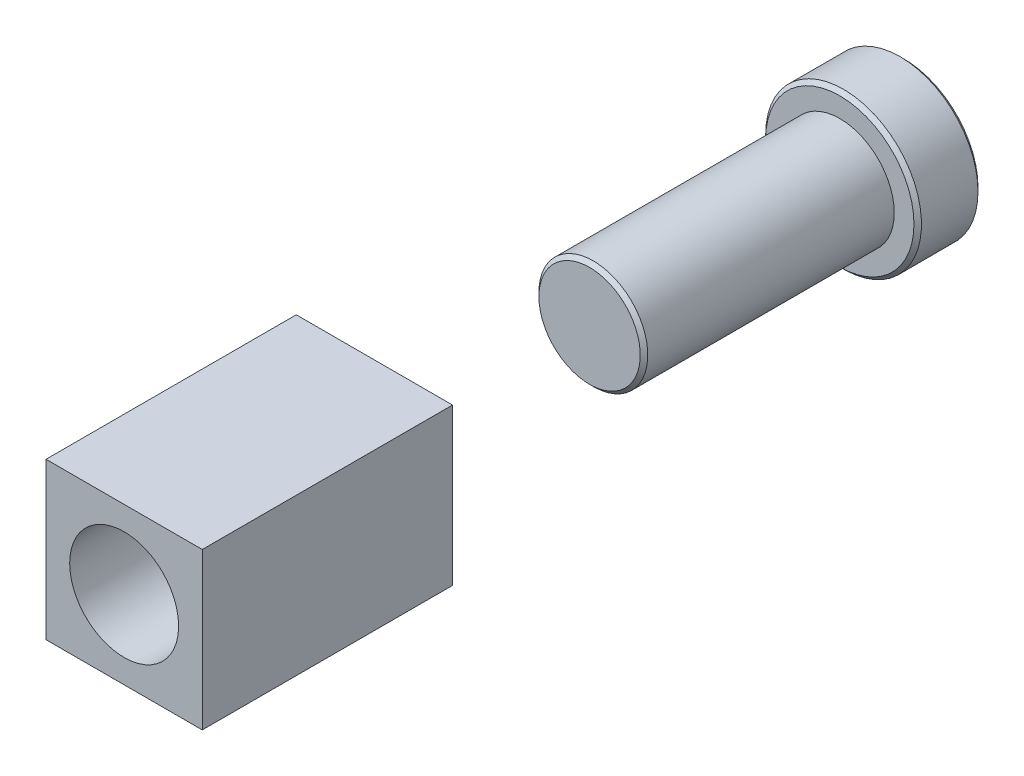
ISO-10303-21;
HEADER;
FILE_DESCRIPTION(('STEP AP214'),'2;1');
FILE_NAME('part.step','',(''),(''),'','','');
FILE_SCHEMA(('AUTOMOTIVE_DESIGN { 1 0 10303 214 1 1 1 1 }'));
ENDSEC;
DATA;
#1=APPLICATION_CONTEXT('core data for automotive mechanical design processes');
#2=APPLICATION_PROTOCOL_DEFINITION('international standard','automotive_design',2000,#1);
#3=PRODUCT_CONTEXT('',#1,'mechanical');
#4=PRODUCT('Part','Part','',(#3));
#5=PRODUCT_RELATED_PRODUCT_CATEGORY('part','',(#4));
#6=PRODUCT_DEFINITION_FORMATION('','',#4);
#7=PRODUCT_DEFINITION_CONTEXT('part definition',#1,'design');
#8=PRODUCT_DEFINITION('design','',#6,#7);
#9=PRODUCT_DEFINITION_SHAPE('','',#8);
#10=(LENGTH_UNIT() NAMED_UNIT(*) SI_UNIT(.MILLI.,.METRE.));
#11=(NAMED_UNIT(*) PLANE_ANGLE_UNIT() SI_UNIT($,.RADIAN.));
#12=(NAMED_UNIT(*) SI_UNIT($,.STERADIAN.) SOLID_ANGLE_UNIT());
#13=UNCERTAINTY_MEASURE_WITH_UNIT(LENGTH_MEASURE(1.E-05),#10,'distance_accuracy_value','');
#14=(GEOMETRIC_REPRESENTATION_CONTEXT(3) GLOBAL_UNCERTAINTY_ASSIGNED_CONTEXT((#13)) GLOBAL_UNIT_ASSIGNED_CONTEXT((#10,
#11,#12)) REPRESENTATION_CONTEXT('',''));
#15=CARTESIAN_POINT('',(0.,0.,0.));
#16=DIRECTION('',(0.,0.,1.));
#17=DIRECTION('',(1.,0.,0.));
#18=AXIS2_PLACEMENT_3D('',#15,#16,#17);
#19=CARTESIAN_POINT('',(-15.8613491960392,15.8613491960392,158.283276511442));
#20=DIRECTION('',(1.,0.,0.));
#21=DIRECTION('',(0.,1.,0.));
#22=AXIS2_PLACEMENT_3D('',#19,#20,#21);
#23=PLANE('',#22);
#24=DIRECTION('',(0.,-1.,0.));
#25=VECTOR('',#24,1.);
#26=CARTESIAN_POINT('',(-15.8613491960392,15.8613491960392,107.483276511442));
#27=LINE('',#26,#25);
#28=CARTESIAN_POINT('',(-15.8613491960392,15.8613491960392,107.483276511442));
#29=VERTEX_POINT('',#28);
#30=CARTESIAN_POINT('',(-15.8613491960392,-15.8613491960392,107.483276511442));
#31=VERTEX_POINT('',#30);
#32=EDGE_CURVE('E104',#29,#31,#27,.T.);
#33=ORIENTED_EDGE('',*,*,#32,.T.);
#34=DIRECTION('',(0.,0.,-1.));
#35=VECTOR('',#34,1.);
#36=CARTESIAN_POINT('',(-15.8613491960392,-15.8613491960392,158.283276511442));
#37=LINE('',#36,#35);
#38=CARTESIAN_POINT('',(-15.8613491960392,-15.8613491960392,158.283276511442));
#39=VERTEX_POINT('',#38);
#40=EDGE_CURVE('E12',#39,#31,#37,.T.);
#41=ORIENTED_EDGE('',*,*,#40,.F.);
#42=DIRECTION('',(0.,-1.,0.));
#43=VECTOR('',#42,1.);
#44=CARTESIAN_POINT('',(-15.8613491960392,15.8613491960392,158.283276511442));
#45=LINE('',#44,#43);
#46=CARTESIAN_POINT('',(-15.8613491960392,15.8613491960392,158.283276511442));
#47=VERTEX_POINT('',#46);
#48=EDGE_CURVE('E92',#47,#39,#45,.T.);
#49=ORIENTED_EDGE('',*,*,#48,.F.);
#50=DIRECTION('',(0.,0.,-1.));
#51=VECTOR('',#50,1.);
#52=CARTESIAN_POINT('',(-15.8613491960392,15.8613491960392,158.283276511442));
#53=LINE('',#52,#51);
#54=EDGE_CURVE('E100',#47,#29,#53,.T.);
#55=ORIENTED_EDGE('',*,*,#54,.T.);
#56=EDGE_LOOP('',(#33,#41,#49,#55));
#57=FACE_BOUND('',#56,.T.);
#58=ADVANCED_FACE('F41',(#57),#23,.F.);
#59=CARTESIAN_POINT('',(-15.8613491960392,-15.8613491960392,158.283276511442));
#60=DIRECTION('',(0.,1.,0.));
#61=DIRECTION('',(0.,0.,1.));
#62=AXIS2_PLACEMENT_3D('',#59,#60,#61);
#63=PLANE('',#62);
#64=DIRECTION('',(1.,0.,0.));
#65=VECTOR('',#64,1.);
#66=CARTESIAN_POINT('',(-15.8613491960392,-15.8613491960392,107.483276511442));
#67=LINE('',#66,#65);
#68=CARTESIAN_POINT('',(15.8613491960392,-15.8613491960392,107.483276511442));
#69=VERTEX_POINT('',#68);
#70=EDGE_CURVE('E96',#31,#69,#67,.T.);
#71=ORIENTED_EDGE('',*,*,#70,.T.);
#72=DIRECTION('',(0.,0.,-1.));
#73=VECTOR('',#72,1.);
#74=CARTESIAN_POINT('',(15.8613491960392,-15.8613491960392,158.283276511442));
#75=LINE('',#74,#73);
#76=CARTESIAN_POINT('',(15.8613491960392,-15.8613491960392,158.283276511442));
#77=VERTEX_POINT('',#76);
#78=EDGE_CURVE('E49',#77,#69,#75,.T.);
#79=ORIENTED_EDGE('',*,*,#78,.F.);
#80=DIRECTION('',(1.,0.,0.));
#81=VECTOR('',#80,1.);
#82=CARTESIAN_POINT('',(-15.8613491960392,-15.8613491960392,158.283276511442));
#83=LINE('',#82,#81);
#84=EDGE_CURVE('E87',#39,#77,#83,.T.);
#85=ORIENTED_EDGE('',*,*,#84,.F.);
#86=ORIENTED_EDGE('',*,*,#40,.T.);
#87=EDGE_LOOP('',(#71,#79,#85,#86));
#88=FACE_BOUND('',#87,.T.);
#89=ADVANCED_FACE('F95',(#88),#63,.F.);
#90=CARTESIAN_POINT('',(15.8613491960392,15.8613491960392,158.283276511442));
#91=DIRECTION('',(-1.,0.,0.));
#92=DIRECTION('',(0.,-1.,0.));
#93=AXIS2_PLACEMENT_3D('',#90,#91,#92);
#94=PLANE('',#93);
#95=DIRECTION('',(0.,1.,0.));
#96=VECTOR('',#95,1.);
#97=CARTESIAN_POINT('',(15.8613491960392,15.8613491960392,107.483276511442));
#98=LINE('',#97,#96);
#99=CARTESIAN_POINT('',(15.8613491960392,15.8613491960392,107.483276511442));
#100=VERTEX_POINT('',#99);
#101=EDGE_CURVE('E74',#69,#100,#98,.T.);
#102=ORIENTED_EDGE('',*,*,#101,.T.);
#103=DIRECTION('',(0.,0.,-1.));
#104=VECTOR('',#103,1.);
#105=CARTESIAN_POINT('',(15.8613491960392,15.8613491960392,158.283276511442));
#106=LINE('',#105,#104);
#107=CARTESIAN_POINT('',(15.8613491960392,15.8613491960392,158.283276511442));
#108=VERTEX_POINT('',#107);
#109=EDGE_CURVE('E97',#108,#100,#106,.T.);
#110=ORIENTED_EDGE('',*,*,#109,.F.);
#111=DIRECTION('',(0.,1.,0.));
#112=VECTOR('',#111,1.);
#113=CARTESIAN_POINT('',(15.8613491960392,15.8613491960392,158.283276511442));
#114=LINE('',#113,#112);
#115=EDGE_CURVE('E90',#77,#108,#114,.T.);
#116=ORIENTED_EDGE('',*,*,#115,.F.);
#117=ORIENTED_EDGE('',*,*,#78,.T.);
#118=EDGE_LOOP('',(#102,#110,#116,#117));
#119=FACE_BOUND('',#118,.T.);
#120=ADVANCED_FACE('F98',(#119),#94,.F.);
#121=CARTESIAN_POINT('',(-15.8613491960392,15.8613491960392,158.283276511442));
#122=DIRECTION('',(0.,-1.,0.));
#123=DIRECTION('',(0.,0.,-1.));
#124=AXIS2_PLACEMENT_3D('',#121,#122,#123);
#125=PLANE('',#124);
#126=DIRECTION('',(-1.,0.,0.));
#127=VECTOR('',#126,1.);
#128=CARTESIAN_POINT('',(-15.8613491960392,15.8613491960392,107.483276511442));
#129=LINE('',#128,#127);
#130=EDGE_CURVE('E80',#100,#29,#129,.T.);
#131=ORIENTED_EDGE('',*,*,#130,.T.);
#132=ORIENTED_EDGE('',*,*,#54,.F.);
#133=DIRECTION('',(-1.,0.,0.));
#134=VECTOR('',#133,1.);
#135=CARTESIAN_POINT('',(-15.8613491960392,15.8613491960392,158.283276511442));
#136=LINE('',#135,#134);
#137=EDGE_CURVE('E57',#108,#47,#136,.T.);
#138=ORIENTED_EDGE('',*,*,#137,.F.);
#139=ORIENTED_EDGE('',*,*,#109,.T.);
#140=EDGE_LOOP('',(#131,#132,#138,#139));
#141=FACE_BOUND('',#140,.T.);
#142=ADVANCED_FACE('F112',(#141),#125,.F.);
#143=CARTESIAN_POINT('',(0.,0.,158.283276511442));
#144=DIRECTION('',(0.,0.,1.));
#145=DIRECTION('',(1.,0.,0.));
#146=AXIS2_PLACEMENT_3D('',#143,#144,#145);
#147=PLANE('',#146);
#148=CARTESIAN_POINT('',(0.,0.,158.283276511442));
#149=DIRECTION('',(0.,0.,-1.));
#150=DIRECTION('',(-1.,0.,0.));
#151=AXIS2_PLACEMENT_3D('',#148,#149,#150);
#152=CIRCLE('',#151,11.05535);
#153=CARTESIAN_POINT('',(-11.05535,0.,158.283276511442));
#154=VERTEX_POINT('',#153);
#155=EDGE_CURVE('E107',#154,#154,#152,.T.);
#156=ORIENTED_EDGE('',*,*,#155,.T.);
#157=EDGE_LOOP('',(#156));
#158=FACE_BOUND('',#157,.T.);
#159=ORIENTED_EDGE('',*,*,#48,.T.);
#160=ORIENTED_EDGE('',*,*,#84,.T.);
#161=ORIENTED_EDGE('',*,*,#115,.T.);
#162=ORIENTED_EDGE('',*,*,#137,.T.);
#163=EDGE_LOOP('',(#159,#160,#161,#162));
#164=FACE_BOUND('',#163,.T.);
#165=ADVANCED_FACE('F88',(#158,#164),#147,.T.);
#166=CARTESIAN_POINT('',(0.,0.,107.483276511442));
#167=DIRECTION('',(0.,0.,1.));
#168=DIRECTION('',(1.,0.,0.));
#169=AXIS2_PLACEMENT_3D('',#166,#167,#168);
#170=PLANE('',#169);
#171=CARTESIAN_POINT('',(0.,0.,107.483276511442));
#172=DIRECTION('',(0.,0.,-1.));
#173=DIRECTION('',(-1.,0.,0.));
#174=AXIS2_PLACEMENT_3D('',#171,#172,#173);
#175=CIRCLE('',#174,11.05535);
#176=CARTESIAN_POINT('',(-11.05535,0.,107.483276511442));
#177=VERTEX_POINT('',#176);
#178=EDGE_CURVE('E118',#177,#177,#175,.T.);
#179=ORIENTED_EDGE('',*,*,#178,.F.);
#180=EDGE_LOOP('',(#179));
#181=FACE_BOUND('',#180,.T.);
#182=ORIENTED_EDGE('',*,*,#32,.F.);
#183=ORIENTED_EDGE('',*,*,#130,.F.);
#184=ORIENTED_EDGE('',*,*,#101,.F.);
#185=ORIENTED_EDGE('',*,*,#70,.F.);
#186=EDGE_LOOP('',(#182,#183,#184,#185));
#187=FACE_BOUND('',#186,.T.);
#188=ADVANCED_FACE('F115',(#181,#187),#170,.F.);
#189=CARTESIAN_POINT('',(0.,0.,158.283276511442));
#190=DIRECTION('',(0.,0.,-1.));
#191=DIRECTION('',(-1.,0.,0.));
#192=AXIS2_PLACEMENT_3D('',#189,#190,#191);
#193=CYLINDRICAL_SURFACE('',#192,11.05535);
#194=ORIENTED_EDGE('',*,*,#155,.F.);
#195=EDGE_LOOP('',(#194));
#196=FACE_BOUND('',#195,.T.);
#197=ORIENTED_EDGE('',*,*,#178,.T.);
#198=EDGE_LOOP('',(#197));
#199=FACE_BOUND('',#198,.T.);
#200=ADVANCED_FACE('F125',(#196,#199),#193,.F.);
#201=CLOSED_SHELL('',(#58,#89,#120,#142,#165,#188,#200));
#202=MANIFOLD_SOLID_BREP('B2',#201);
#203=CARTESIAN_POINT('',(0.,0.,12.9988235294118));
#204=DIRECTION('',(0.,0.,1.));
#205=DIRECTION('',(1.,0.,0.));
#206=AXIS2_PLACEMENT_3D('',#203,#204,#205);
#207=PLANE('',#206);
#208=CARTESIAN_POINT('',(0.,0.,12.9988235294118));
#209=DIRECTION('',(0.,0.,1.));
#210=DIRECTION('',(1.,0.,0.));
#211=AXIS2_PLACEMENT_3D('',#208,#209,#210);
#212=CIRCLE('',#211,15.0495000000001);
#213=CARTESIAN_POINT('',(15.0495000000001,0.,12.9988235294118));
#214=VERTEX_POINT('',#213);
#215=EDGE_CURVE('E197',#214,#214,#212,.T.);
#216=ORIENTED_EDGE('',*,*,#215,.T.);
#217=EDGE_LOOP('',(#216));
#218=FACE_BOUND('',#217,.T.);
#219=CARTESIAN_POINT('',(0.,0.,12.9988235294118));
#220=DIRECTION('',(0.,0.,1.));
#221=DIRECTION('',(1.,0.,0.));
#222=AXIS2_PLACEMENT_3D('',#219,#220,#221);
#223=CIRCLE('',#222,11.049);
#224=CARTESIAN_POINT('',(11.049,0.,12.9988235294118));
#225=VERTEX_POINT('',#224);
#226=EDGE_CURVE('E212',#225,#225,#223,.T.);
#227=ORIENTED_EDGE('',*,*,#226,.F.);
#228=EDGE_LOOP('',(#227));
#229=FACE_BOUND('',#228,.T.);
#230=ADVANCED_FACE('F186',(#218,#229),#207,.T.);
#231=CARTESIAN_POINT('',(0.,0.,12.9988235294118));
#232=DIRECTION('',(0.,0.,-1.));
#233=DIRECTION('',(-1.,0.,0.));
#234=AXIS2_PLACEMENT_3D('',#231,#232,#233);
#235=CYLINDRICAL_SURFACE('',#234,15.8115);
#236=CARTESIAN_POINT('',(0.,0.,0.762000000000034));
#237=DIRECTION('',(0.,0.,1.));
#238=DIRECTION('',(1.,0.,0.));
#239=AXIS2_PLACEMENT_3D('',#236,#237,#238);
#240=CIRCLE('',#239,15.8115);
#241=CARTESIAN_POINT('',(-15.8115,0.,0.762000000000032));
#242=VERTEX_POINT('',#241);
#243=EDGE_CURVE('E206',#242,#242,#240,.T.);
#244=CARTESIAN_POINT('',(0.,0.,12.2368235294118));
#245=DIRECTION('',(0.,0.,1.));
#246=DIRECTION('',(1.,0.,0.));
#247=AXIS2_PLACEMENT_3D('',#244,#245,#246);
#248=CIRCLE('',#247,15.8115);
#249=CARTESIAN_POINT('',(-15.8115,0.,12.2368235294118));
#250=VERTEX_POINT('',#249);
#251=EDGE_CURVE('E209',#250,#250,#248,.F.);
#252=CARTESIAN_POINT('',(-15.8115,0.,0.762000000000032));
#253=CARTESIAN_POINT('',(-15.8115,0.,0.881529411764738));
#254=CARTESIAN_POINT('',(-15.8115,0.,1.00105882352944));
#255=CARTESIAN_POINT('',(-15.8115,0.,1.24011764705886));
#256=CARTESIAN_POINT('',(-15.8115,0.,1.35964705882356));
#257=CARTESIAN_POINT('',(-15.8115,0.,1.59870588235297));
#258=CARTESIAN_POINT('',(-15.8115,0.,1.71823529411768));
#259=CARTESIAN_POINT('',(-15.8115,0.,1.95729411764709));
#260=CARTESIAN_POINT('',(-15.8115,0.,2.0768235294118));
#261=CARTESIAN_POINT('',(-15.8115,0.,2.31588235294121));
#262=CARTESIAN_POINT('',(-15.8115,0.,2.43541176470592));
#263=CARTESIAN_POINT('',(-15.8115,0.,2.67447058823533));
#264=CARTESIAN_POINT('',(-15.8115,0.,2.79400000000004));
#265=CARTESIAN_POINT('',(-15.8115,0.,3.03305882352945));
#266=CARTESIAN_POINT('',(-15.8115,0.,3.15258823529415));
#267=CARTESIAN_POINT('',(-15.8115,0.,3.39164705882357));
#268=CARTESIAN_POINT('',(-15.8115,0.,3.51117647058827));
#269=CARTESIAN_POINT('',(-15.8115,0.,3.75023529411768));
#270=CARTESIAN_POINT('',(-15.8115,0.,3.86976470588239));
#271=CARTESIAN_POINT('',(-15.8115,0.,4.1088235294118));
#272=CARTESIAN_POINT('',(-15.8115,0.,4.22835294117651));
#273=CARTESIAN_POINT('',(-15.8115,0.,4.46741176470592));
#274=CARTESIAN_POINT('',(-15.8115,0.,4.58694117647063));
#275=CARTESIAN_POINT('',(-15.8115,0.,4.82600000000004));
#276=CARTESIAN_POINT('',(-15.8115,0.,4.94552941176475));
#277=CARTESIAN_POINT('',(-15.8115,0.,5.18458823529416));
#278=CARTESIAN_POINT('',(-15.8115,0.,5.30411764705886));
#279=CARTESIAN_POINT('',(-15.8115,0.,5.54317647058827));
#280=CARTESIAN_POINT('',(-15.8115,0.,5.66270588235298));
#281=CARTESIAN_POINT('',(-15.8115,0.,5.90176470588239));
#282=CARTESIAN_POINT('',(-15.8115,0.,6.0212941176471));
#283=CARTESIAN_POINT('',(-15.8115,0.,6.26035294117651));
#284=CARTESIAN_POINT('',(-15.8115,0.,6.37988235294122));
#285=CARTESIAN_POINT('',(-15.8115,0.,6.61894117647063));
#286=CARTESIAN_POINT('',(-15.8115,0.,6.73847058823534));
#287=CARTESIAN_POINT('',(-15.8115,0.,6.97752941176475));
#288=CARTESIAN_POINT('',(-15.8115,0.,7.09705882352945));
#289=CARTESIAN_POINT('',(-15.8115,0.,7.33611764705887));
#290=CARTESIAN_POINT('',(-15.8115,0.,7.45564705882357));
#291=CARTESIAN_POINT('',(-15.8115,0.,7.69470588235298));
#292=CARTESIAN_POINT('',(-15.8115,0.,7.81423529411769));
#293=CARTESIAN_POINT('',(-15.8115,0.,8.0532941176471));
#294=CARTESIAN_POINT('',(-15.8115,0.,8.17282352941181));
#295=CARTESIAN_POINT('',(-15.8115,0.,8.41188235294122));
#296=CARTESIAN_POINT('',(-15.8115,0.,8.53141176470593));
#297=CARTESIAN_POINT('',(-15.8115,0.,8.77047058823534));
#298=CARTESIAN_POINT('',(-15.8115,0.,8.89000000000004));
#299=CARTESIAN_POINT('',(-15.8115,0.,9.12905882352946));
#300=CARTESIAN_POINT('',(-15.8115,0.,9.24858823529416));
#301=CARTESIAN_POINT('',(-15.8115,0.,9.48764705882357));
#302=CARTESIAN_POINT('',(-15.8115,0.,9.60717647058828));
#303=CARTESIAN_POINT('',(-15.8115,0.,9.84623529411769));
#304=CARTESIAN_POINT('',(-15.8115,0.,9.9657647058824));
#305=CARTESIAN_POINT('',(-15.8115,0.,10.2048235294118));
#306=CARTESIAN_POINT('',(-15.8115,0.,10.3243529411765));
#307=CARTESIAN_POINT('',(-15.8115,0.,10.5634117647059));
#308=CARTESIAN_POINT('',(-15.8115,0.,10.6829411764706));
#309=CARTESIAN_POINT('',(-15.8115,0.,10.922));
#310=CARTESIAN_POINT('',(-15.8115,0.,11.0415294117648));
#311=CARTESIAN_POINT('',(-15.8115,0.,11.2805882352942));
#312=CARTESIAN_POINT('',(-15.8115,0.,11.4001176470589));
#313=CARTESIAN_POINT('',(-15.8115,0.,11.6391764705883));
#314=CARTESIAN_POINT('',(-15.8115,0.,11.758705882353));
#315=CARTESIAN_POINT('',(-15.8115,0.,11.9977647058824));
#316=CARTESIAN_POINT('',(-15.8115,0.,12.1172941176471));
#317=CARTESIAN_POINT('',(-15.8115,0.,12.2368235294118));
#318=B_SPLINE_CURVE_WITH_KNOTS('',3,(#252,#253,#254,#255,#256,#257,#258,#259,#260,#261,#262,
#263,#264,#265,#266,#267,#268,#269,#270,#271,#272,#273,#274,#275,#276,#277,#278,#279,#280,#281,
#282,#283,#284,#285,#286,#287,#288,#289,#290,#291,#292,#293,#294,#295,#296,#297,#298,#299,#300,
#301,#302,#303,#304,#305,#306,#307,#308,#309,#310,#311,#312,#313,#314,#315,#316,#317),
.UNSPECIFIED.,.F.,.F.,(4,2,2,2,2,2,2,2,2,2,2,2,2,2,2,2,2,2,2,2,2,2,2,2,2,2,2,2,2,2,2,2,4),(0.,
0.358588235294117,0.717176470588237,1.07576470588235,1.43435294117647,1.79294117647059,
2.15152941176471,2.51011764705883,2.86870588235295,3.22729411764706,3.58588235294118,
3.9444705882353,4.30305882352942,4.66164705882354,5.02023529411766,5.37882352941177,
5.73741176470589,6.09600000000001,6.45458823529413,6.81317647058825,7.17176470588237,
7.53035294117648,7.8889411764706,8.24752941176472,8.60611764705884,8.96470588235296,
9.32329411764707,9.68188235294119,10.0404705882353,10.3990588235294,10.7576470588235,
11.1162352941177,11.4748235294118),.UNSPECIFIED.);
#319=EDGE_CURVE('BSEAM219',#242,#250,#318,.T.);
#320=ORIENTED_EDGE('',*,*,#243,.T.);
#321=ORIENTED_EDGE('',*,*,#251,.T.);
#322=ORIENTED_EDGE('',*,*,#319,.T.);
#323=ORIENTED_EDGE('',*,*,#319,.F.);
#324=EDGE_LOOP('',(#320,#322,#321,#323));
#325=FACE_BOUND('',#324,.T.);
#326=ADVANCED_FACE('F219',(#325),#235,.T.);
#327=CARTESIAN_POINT('',(0.,0.,0.));
#328=DIRECTION('',(0.,0.,1.));
#329=DIRECTION('',(1.,0.,0.));
#330=AXIS2_PLACEMENT_3D('',#327,#328,#329);
#331=PLANE('',#330);
#332=CARTESIAN_POINT('',(0.,0.,0.));
#333=DIRECTION('',(0.,0.,1.));
#334=DIRECTION('',(1.,0.,0.));
#335=AXIS2_PLACEMENT_3D('',#332,#333,#334);
#336=CIRCLE('',#335,15.0495);
#337=CARTESIAN_POINT('',(15.0495,0.,0.));
#338=VERTEX_POINT('',#337);
#339=EDGE_CURVE('E201',#338,#338,#336,.F.);
#340=ORIENTED_EDGE('',*,*,#339,.T.);
#341=EDGE_LOOP('',(#340));
#342=FACE_BOUND('',#341,.T.);
#343=ADVANCED_FACE('F225',(#342),#331,.F.);
#344=CARTESIAN_POINT('',(0.,0.,63.7988235294118));
#345=DIRECTION('',(0.,0.,-1.));
#346=DIRECTION('',(-1.,0.,0.));
#347=AXIS2_PLACEMENT_3D('',#344,#345,#346);
#348=CYLINDRICAL_SURFACE('',#347,11.049);
#349=CARTESIAN_POINT('',(0.,0.,63.0368235294118));
#350=DIRECTION('',(0.,0.,1.));
#351=DIRECTION('',(1.,0.,0.));
#352=AXIS2_PLACEMENT_3D('',#349,#350,#351);
#353=CIRCLE('',#352,11.049);
#354=CARTESIAN_POINT('',(-11.049,0.,63.0368235294117));
#355=VERTEX_POINT('',#354);
#356=EDGE_CURVE('E40',#355,#355,#353,.F.);
#357=ORIENTED_EDGE('',*,*,#356,.T.);
#358=EDGE_LOOP('',(#357));
#359=FACE_BOUND('',#358,.T.);
#360=ORIENTED_EDGE('',*,*,#226,.T.);
#361=EDGE_LOOP('',(#360));
#362=FACE_BOUND('',#361,.T.);
#363=ADVANCED_FACE('F216',(#359,#362),#348,.T.);
#364=CARTESIAN_POINT('',(0.,0.,63.7988235294118));
#365=DIRECTION('',(0.,0.,1.));
#366=DIRECTION('',(1.,0.,0.));
#367=AXIS2_PLACEMENT_3D('',#364,#365,#366);
#368=PLANE('',#367);
#369=CARTESIAN_POINT('',(0.,0.,63.7988235294118));
#370=DIRECTION('',(0.,0.,1.));
#371=DIRECTION('',(1.,0.,0.));
#372=AXIS2_PLACEMENT_3D('',#369,#370,#371);
#373=CIRCLE('',#372,10.287);
#374=CARTESIAN_POINT('',(-10.287,0.,63.7988235294118));
#375=VERTEX_POINT('',#374);
#376=EDGE_CURVE('E193',#375,#375,#373,.T.);
#377=ORIENTED_EDGE('',*,*,#376,.T.);
#378=EDGE_LOOP('',(#377));
#379=FACE_BOUND('',#378,.T.);
#380=ADVANCED_FACE('F237',(#379),#368,.T.);
#381=CARTESIAN_POINT('',(0.,0.,0.762000000000034));
#382=DIRECTION('',(0.,0.,1.));
#383=DIRECTION('',(1.,0.,0.));
#384=AXIS2_PLACEMENT_3D('',#381,#382,#383);
#385=CONICAL_SURFACE('',#384,15.8115,0.785398163397453);
#386=ORIENTED_EDGE('',*,*,#339,.F.);
#387=EDGE_LOOP('',(#386));
#388=FACE_BOUND('',#387,.T.);
#389=ORIENTED_EDGE('',*,*,#243,.F.);
#390=EDGE_LOOP('',(#389));
#391=FACE_BOUND('',#390,.T.);
#392=ADVANCED_FACE('F234',(#388,#391),#385,.T.);
#393=CARTESIAN_POINT('',(0.,0.,12.9988235294118));
#394=DIRECTION('',(0.,0.,-1.));
#395=DIRECTION('',(-1.,0.,0.));
#396=AXIS2_PLACEMENT_3D('',#393,#394,#395);
#397=CONICAL_SURFACE('',#396,15.0495000000001,0.785398163397446);
#398=ORIENTED_EDGE('',*,*,#251,.F.);
#399=EDGE_LOOP('',(#398));
#400=FACE_BOUND('',#399,.T.);
#401=ORIENTED_EDGE('',*,*,#215,.F.);
#402=EDGE_LOOP('',(#401));
#403=FACE_BOUND('',#402,.T.);
#404=ADVANCED_FACE('F236',(#400,#403),#397,.T.);
#405=CARTESIAN_POINT('',(0.,0.,63.7988235294118));
#406=DIRECTION('',(0.,0.,-1.));
#407=DIRECTION('',(-1.,0.,0.));
#408=AXIS2_PLACEMENT_3D('',#405,#406,#407);
#409=CONICAL_SURFACE('',#408,10.287,0.785398163397446);
#410=CARTESIAN_POINT('',(-11.049,0.,63.0368235294117));
#411=CARTESIAN_POINT('',(-11.0410625,0.,63.0447610294118));
#412=CARTESIAN_POINT('',(-11.033125,0.,63.0526985294118));
#413=CARTESIAN_POINT('',(-11.01725,0.,63.0685735294118));
#414=CARTESIAN_POINT('',(-11.0093125,0.,63.0765110294118));
#415=CARTESIAN_POINT('',(-10.9934375,0.,63.0923860294117));
#416=CARTESIAN_POINT('',(-10.9855,0.,63.1003235294118));
#417=CARTESIAN_POINT('',(-10.969625,0.,63.1161985294117));
#418=CARTESIAN_POINT('',(-10.9616875,0.,63.1241360294118));
#419=CARTESIAN_POINT('',(-10.9458125,0.,63.1400110294117));
#420=CARTESIAN_POINT('',(-10.937875,0.,63.1479485294117));
#421=CARTESIAN_POINT('',(-10.922,0.,63.1638235294117));
#422=CARTESIAN_POINT('',(-10.9140625,0.,63.1717610294118));
#423=CARTESIAN_POINT('',(-10.8981875,0.,63.1876360294118));
#424=CARTESIAN_POINT('',(-10.89025,0.,63.1955735294118));
#425=CARTESIAN_POINT('',(-10.874375,0.,63.2114485294118));
#426=CARTESIAN_POINT('',(-10.8664375,0.,63.2193860294118));
#427=CARTESIAN_POINT('',(-10.8505625,0.,63.2352610294118));
#428=CARTESIAN_POINT('',(-10.842625,0.,63.2431985294117));
#429=CARTESIAN_POINT('',(-10.82675,0.,63.2590735294118));
#430=CARTESIAN_POINT('',(-10.8188125,0.,63.2670110294117));
#431=CARTESIAN_POINT('',(-10.8029375,0.,63.2828860294117));
#432=CARTESIAN_POINT('',(-10.795,0.,63.2908235294118));
#433=CARTESIAN_POINT('',(-10.779125,0.,63.3066985294118));
#434=CARTESIAN_POINT('',(-10.7711875,0.,63.3146360294118));
#435=CARTESIAN_POINT('',(-10.7553125,0.,63.3305110294118));
#436=CARTESIAN_POINT('',(-10.747375,0.,63.3384485294118));
#437=CARTESIAN_POINT('',(-10.7315,0.,63.3543235294118));
#438=CARTESIAN_POINT('',(-10.7235625,0.,63.3622610294118));
#439=CARTESIAN_POINT('',(-10.7076875,0.,63.3781360294117));
#440=CARTESIAN_POINT('',(-10.69975,0.,63.3860735294118));
#441=CARTESIAN_POINT('',(-10.683875,0.,63.4019485294117));
#442=CARTESIAN_POINT('',(-10.6759375,0.,63.4098860294118));
#443=CARTESIAN_POINT('',(-10.6600625,0.,63.4257610294117));
#444=CARTESIAN_POINT('',(-10.652125,0.,63.4336985294118));
#445=CARTESIAN_POINT('',(-10.63625,0.,63.4495735294118));
#446=CARTESIAN_POINT('',(-10.6283125,0.,63.4575110294118));
#447=CARTESIAN_POINT('',(-10.6124375,0.,63.4733860294118));
#448=CARTESIAN_POINT('',(-10.6045,0.,63.4813235294118));
#449=CARTESIAN_POINT('',(-10.588625,0.,63.4971985294118));
#450=CARTESIAN_POINT('',(-10.5806875,0.,63.5051360294118));
#451=CARTESIAN_POINT('',(-10.5648125,0.,63.5210110294118));
#452=CARTESIAN_POINT('',(-10.556875,0.,63.5289485294117));
#453=CARTESIAN_POINT('',(-10.541,0.,63.5448235294118));
#454=CARTESIAN_POINT('',(-10.5330625,0.,63.5527610294118));
#455=CARTESIAN_POINT('',(-10.5171875,0.,63.5686360294118));
#456=CARTESIAN_POINT('',(-10.50925,0.,63.5765735294118));
#457=CARTESIAN_POINT('',(-10.493375,0.,63.5924485294118));
#458=CARTESIAN_POINT('',(-10.4854375,0.,63.6003860294118));
#459=CARTESIAN_POINT('',(-10.4695625,0.,63.6162610294118));
#460=CARTESIAN_POINT('',(-10.461625,0.,63.6241985294118));
#461=CARTESIAN_POINT('',(-10.44575,0.,63.6400735294118));
#462=CARTESIAN_POINT('',(-10.4378125,0.,63.6480110294118));
#463=CARTESIAN_POINT('',(-10.4219375,0.,63.6638860294118));
#464=CARTESIAN_POINT('',(-10.414,0.,63.6718235294118));
#465=CARTESIAN_POINT('',(-10.398125,0.,63.6876985294118));
#466=CARTESIAN_POINT('',(-10.3901875,0.,63.6956360294118));
#467=CARTESIAN_POINT('',(-10.3743125,0.,63.7115110294118));
#468=CARTESIAN_POINT('',(-10.366375,0.,63.7194485294118));
#469=CARTESIAN_POINT('',(-10.3505,0.,63.7353235294118));
#470=CARTESIAN_POINT('',(-10.3425625,0.,63.7432610294118));
#471=CARTESIAN_POINT('',(-10.3266875,0.,63.7591360294118));
#472=CARTESIAN_POINT('',(-10.31875,0.,63.7670735294118));
#473=CARTESIAN_POINT('',(-10.302875,0.,63.7829485294118));
#474=CARTESIAN_POINT('',(-10.2949375,0.,63.7908860294118));
#475=CARTESIAN_POINT('',(-10.287,0.,63.7988235294118));
#476=B_SPLINE_CURVE_WITH_KNOTS('',3,(#410,#411,#412,#413,#414,#415,#416,#417,#418,#419,#420,
#421,#422,#423,#424,#425,#426,#427,#428,#429,#430,#431,#432,#433,#434,#435,#436,#437,#438,#439,
#440,#441,#442,#443,#444,#445,#446,#447,#448,#449,#450,#451,#452,#453,#454,#455,#456,#457,#458,
#459,#460,#461,#462,#463,#464,#465,#466,#467,#468,#469,#470,#471,#472,#473,#474,#475),
.UNSPECIFIED.,.F.,.F.,(4,2,2,2,2,2,2,2,2,2,2,2,2,2,2,2,2,2,2,2,2,2,2,2,2,2,2,2,2,2,2,2,4),(0.,
0.0336759604540172,0.0673519209080259,0.101027881362033,0.134703841816042,0.168379802270049,
0.202055762724067,0.235731723178075,0.269407683632083,0.303083644086091,0.336759604540099,
0.370435564994117,0.404111525448125,0.437787485902133,0.471463446356141,0.50513940681015,
0.538815367264157,0.572491327718174,0.606167288172183,0.63984324862619,0.673519209080199,
0.707195169534206,0.740871129988225,0.774547090442232,0.80822305089624,0.841899011350248,
0.875574971804256,0.909250932258274,0.942926892712281,0.97660285316629,1.0102788136203,
1.04395477407431,1.07763073452832),.UNSPECIFIED.);
#477=EDGE_CURVE('BSEAM188',#355,#375,#476,.T.);
#478=ORIENTED_EDGE('',*,*,#356,.F.);
#479=ORIENTED_EDGE('',*,*,#376,.F.);
#480=ORIENTED_EDGE('',*,*,#477,.T.);
#481=ORIENTED_EDGE('',*,*,#477,.F.);
#482=EDGE_LOOP('',(#478,#480,#479,#481));
#483=FACE_BOUND('',#482,.T.);
#484=ADVANCED_FACE('F188',(#483),#409,.T.);
#485=CLOSED_SHELL('',(#230,#326,#343,#363,#380,#392,#404,#484));
#486=MANIFOLD_SOLID_BREP('B6',#485);
#487=ADVANCED_BREP_SHAPE_REPRESENTATION('',(#18,#202,#486),#14);
#488=SHAPE_DEFINITION_REPRESENTATION(#9,#487);
ENDSEC;
END-ISO-10303-21;
